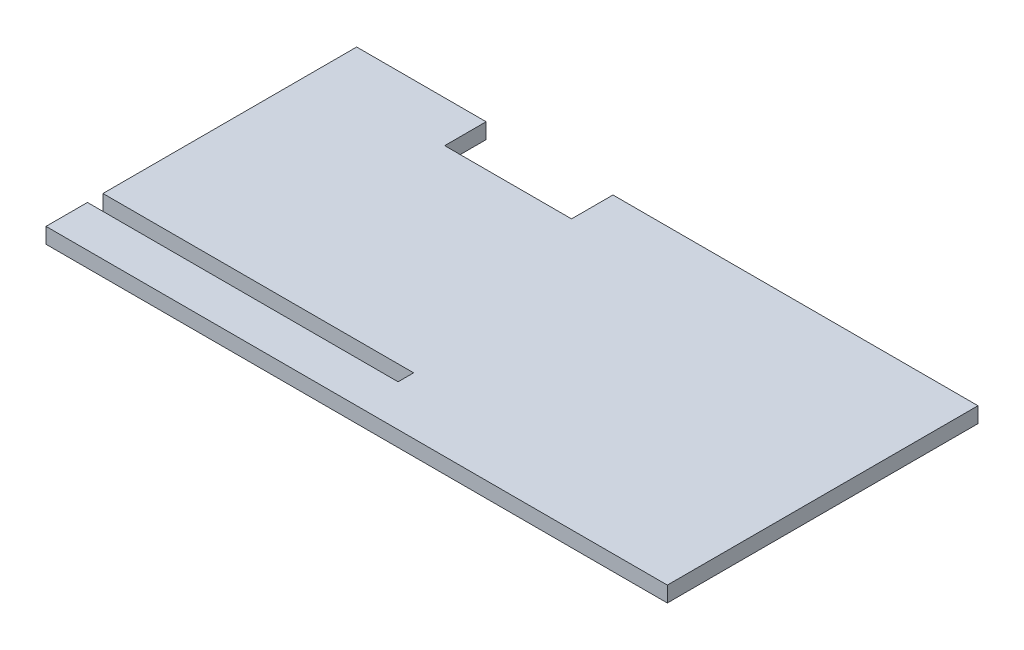
ISO-10303-21;
HEADER;
FILE_DESCRIPTION(('STEP AP214'),'2;1');
FILE_NAME('part.step','',(''),(''),'','','');
FILE_SCHEMA(('AUTOMOTIVE_DESIGN { 1 0 10303 214 1 1 1 1 }'));
ENDSEC;
DATA;
#1=APPLICATION_CONTEXT('core data for automotive mechanical design processes');
#2=APPLICATION_PROTOCOL_DEFINITION('international standard','automotive_design',2000,#1);
#3=PRODUCT_CONTEXT('',#1,'mechanical');
#4=PRODUCT('Part','Part','',(#3));
#5=PRODUCT_RELATED_PRODUCT_CATEGORY('part','',(#4));
#6=PRODUCT_DEFINITION_FORMATION('','',#4);
#7=PRODUCT_DEFINITION_CONTEXT('part definition',#1,'design');
#8=PRODUCT_DEFINITION('design','',#6,#7);
#9=PRODUCT_DEFINITION_SHAPE('','',#8);
#10=(LENGTH_UNIT() NAMED_UNIT(*) SI_UNIT(.MILLI.,.METRE.));
#11=(NAMED_UNIT(*) PLANE_ANGLE_UNIT() SI_UNIT($,.RADIAN.));
#12=(NAMED_UNIT(*) SI_UNIT($,.STERADIAN.) SOLID_ANGLE_UNIT());
#13=UNCERTAINTY_MEASURE_WITH_UNIT(LENGTH_MEASURE(1.E-05),#10,'distance_accuracy_value','');
#14=(GEOMETRIC_REPRESENTATION_CONTEXT(3) GLOBAL_UNCERTAINTY_ASSIGNED_CONTEXT((#13)) GLOBAL_UNIT_ASSIGNED_CONTEXT((#10,
#11,#12)) REPRESENTATION_CONTEXT('',''));
#15=CARTESIAN_POINT('',(0.,0.,0.));
#16=DIRECTION('',(0.,0.,1.));
#17=DIRECTION('',(1.,0.,0.));
#18=AXIS2_PLACEMENT_3D('',#15,#16,#17);
#19=CARTESIAN_POINT('',(-10.5,3.,0.));
#20=DIRECTION('',(-1.,0.,0.));
#21=DIRECTION('',(0.,0.,1.));
#22=AXIS2_PLACEMENT_3D('',#19,#20,#21);
#23=PLANE('',#22);
#24=DIRECTION('',(0.,0.,-1.));
#25=VECTOR('',#24,1.);
#26=CARTESIAN_POINT('',(-10.5,0.,0.));
#27=LINE('',#26,#25);
#28=CARTESIAN_POINT('',(-10.5,0.,-32.));
#29=VERTEX_POINT('',#28);
#30=CARTESIAN_POINT('',(-10.5,0.,-40.));
#31=VERTEX_POINT('',#30);
#32=EDGE_CURVE('E159',#29,#31,#27,.T.);
#33=ORIENTED_EDGE('',*,*,#32,.F.);
#34=DIRECTION('',(0.,-1.,0.));
#35=VECTOR('',#34,1.);
#36=CARTESIAN_POINT('',(-10.5,3.,-32.));
#37=LINE('',#36,#35);
#38=CARTESIAN_POINT('',(-10.5,3.,-32.));
#39=VERTEX_POINT('',#38);
#40=EDGE_CURVE('E12',#39,#29,#37,.T.);
#41=ORIENTED_EDGE('',*,*,#40,.F.);
#42=DIRECTION('',(0.,0.,-1.));
#43=VECTOR('',#42,1.);
#44=CARTESIAN_POINT('',(-10.5,3.,0.));
#45=LINE('',#44,#43);
#46=CARTESIAN_POINT('',(-10.5,3.,-40.));
#47=VERTEX_POINT('',#46);
#48=EDGE_CURVE('E249',#39,#47,#45,.T.);
#49=ORIENTED_EDGE('',*,*,#48,.T.);
#50=DIRECTION('',(0.,-1.,0.));
#51=VECTOR('',#50,1.);
#52=CARTESIAN_POINT('',(-10.5,3.,-40.));
#53=LINE('',#52,#51);
#54=EDGE_CURVE('E54',#47,#31,#53,.T.);
#55=ORIENTED_EDGE('',*,*,#54,.T.);
#56=EDGE_LOOP('',(#33,#41,#49,#55));
#57=FACE_BOUND('',#56,.T.);
#58=ADVANCED_FACE('F38',(#57),#23,.T.);
#59=CARTESIAN_POINT('',(0.,3.,-32.));
#60=DIRECTION('',(0.,0.,-1.));
#61=DIRECTION('',(-1.,0.,0.));
#62=AXIS2_PLACEMENT_3D('',#59,#60,#61);
#63=PLANE('',#62);
#64=DIRECTION('',(1.,0.,0.));
#65=VECTOR('',#64,1.);
#66=CARTESIAN_POINT('',(0.,0.,-32.));
#67=LINE('',#66,#65);
#68=CARTESIAN_POINT('',(-35.,0.,-32.));
#69=VERTEX_POINT('',#68);
#70=EDGE_CURVE('E226',#69,#29,#67,.T.);
#71=ORIENTED_EDGE('',*,*,#70,.F.);
#72=DIRECTION('',(0.,-1.,0.));
#73=VECTOR('',#72,1.);
#74=CARTESIAN_POINT('',(-35.,3.,-32.));
#75=LINE('',#74,#73);
#76=CARTESIAN_POINT('',(-35.,3.,-32.));
#77=VERTEX_POINT('',#76);
#78=EDGE_CURVE('E46',#77,#69,#75,.T.);
#79=ORIENTED_EDGE('',*,*,#78,.F.);
#80=DIRECTION('',(1.,0.,0.));
#81=VECTOR('',#80,1.);
#82=CARTESIAN_POINT('',(0.,3.,-32.));
#83=LINE('',#82,#81);
#84=EDGE_CURVE('E251',#77,#39,#83,.T.);
#85=ORIENTED_EDGE('',*,*,#84,.T.);
#86=ORIENTED_EDGE('',*,*,#40,.T.);
#87=EDGE_LOOP('',(#71,#79,#85,#86));
#88=FACE_BOUND('',#87,.T.);
#89=ADVANCED_FACE('F227',(#88),#63,.T.);
#90=CARTESIAN_POINT('',(-35.,3.,0.));
#91=DIRECTION('',(1.,0.,0.));
#92=DIRECTION('',(0.,0.,-1.));
#93=AXIS2_PLACEMENT_3D('',#90,#91,#92);
#94=PLANE('',#93);
#95=DIRECTION('',(0.,0.,1.));
#96=VECTOR('',#95,1.);
#97=CARTESIAN_POINT('',(-35.,0.,0.));
#98=LINE('',#97,#96);
#99=CARTESIAN_POINT('',(-35.,0.,-40.));
#100=VERTEX_POINT('',#99);
#101=EDGE_CURVE('E218',#100,#69,#98,.T.);
#102=ORIENTED_EDGE('',*,*,#101,.F.);
#103=DIRECTION('',(0.,-1.,0.));
#104=VECTOR('',#103,1.);
#105=CARTESIAN_POINT('',(-35.,3.,-40.));
#106=LINE('',#105,#104);
#107=CARTESIAN_POINT('',(-35.,3.,-40.));
#108=VERTEX_POINT('',#107);
#109=EDGE_CURVE('E211',#108,#100,#106,.T.);
#110=ORIENTED_EDGE('',*,*,#109,.F.);
#111=DIRECTION('',(0.,0.,1.));
#112=VECTOR('',#111,1.);
#113=CARTESIAN_POINT('',(-35.,3.,0.));
#114=LINE('',#113,#112);
#115=EDGE_CURVE('E221',#108,#77,#114,.T.);
#116=ORIENTED_EDGE('',*,*,#115,.T.);
#117=ORIENTED_EDGE('',*,*,#78,.T.);
#118=EDGE_LOOP('',(#102,#110,#116,#117));
#119=FACE_BOUND('',#118,.T.);
#120=ADVANCED_FACE('F216',(#119),#94,.T.);
#121=CARTESIAN_POINT('',(0.,3.,-40.));
#122=DIRECTION('',(0.,0.,-1.));
#123=DIRECTION('',(-1.,0.,0.));
#124=AXIS2_PLACEMENT_3D('',#121,#122,#123);
#125=PLANE('',#124);
#126=DIRECTION('',(1.,0.,0.));
#127=VECTOR('',#126,1.);
#128=CARTESIAN_POINT('',(0.,0.,-40.));
#129=LINE('',#128,#127);
#130=CARTESIAN_POINT('',(-60.,0.,-40.));
#131=VERTEX_POINT('',#130);
#132=EDGE_CURVE('E232',#131,#100,#129,.T.);
#133=ORIENTED_EDGE('',*,*,#132,.F.);
#134=DIRECTION('',(0.,-1.,0.));
#135=VECTOR('',#134,1.);
#136=CARTESIAN_POINT('',(-60.,3.,-40.));
#137=LINE('',#136,#135);
#138=CARTESIAN_POINT('',(-60.,3.,-40.));
#139=VERTEX_POINT('',#138);
#140=EDGE_CURVE('E209',#139,#131,#137,.T.);
#141=ORIENTED_EDGE('',*,*,#140,.F.);
#142=DIRECTION('',(1.,0.,0.));
#143=VECTOR('',#142,1.);
#144=CARTESIAN_POINT('',(0.,3.,-40.));
#145=LINE('',#144,#143);
#146=EDGE_CURVE('E154',#139,#108,#145,.T.);
#147=ORIENTED_EDGE('',*,*,#146,.T.);
#148=ORIENTED_EDGE('',*,*,#109,.T.);
#149=EDGE_LOOP('',(#133,#141,#147,#148));
#150=FACE_BOUND('',#149,.T.);
#151=ADVANCED_FACE('F265',(#150),#125,.T.);
#152=CARTESIAN_POINT('',(-60.,3.,0.));
#153=DIRECTION('',(-1.,0.,0.));
#154=DIRECTION('',(0.,0.,1.));
#155=AXIS2_PLACEMENT_3D('',#152,#153,#154);
#156=PLANE('',#155);
#157=DIRECTION('',(0.,0.,-1.));
#158=VECTOR('',#157,1.);
#159=CARTESIAN_POINT('',(-60.,0.,0.));
#160=LINE('',#159,#158);
#161=CARTESIAN_POINT('',(-60.,0.,9.));
#162=VERTEX_POINT('',#161);
#163=EDGE_CURVE('E234',#162,#131,#160,.T.);
#164=ORIENTED_EDGE('',*,*,#163,.F.);
#165=DIRECTION('',(0.,-1.,0.));
#166=VECTOR('',#165,1.);
#167=CARTESIAN_POINT('',(-60.,3.,9.));
#168=LINE('',#167,#166);
#169=CARTESIAN_POINT('',(-60.,3.,9.));
#170=VERTEX_POINT('',#169);
#171=EDGE_CURVE('E207',#170,#162,#168,.T.);
#172=ORIENTED_EDGE('',*,*,#171,.F.);
#173=DIRECTION('',(0.,0.,-1.));
#174=VECTOR('',#173,1.);
#175=CARTESIAN_POINT('',(-60.,3.,0.));
#176=LINE('',#175,#174);
#177=EDGE_CURVE('E166',#170,#139,#176,.T.);
#178=ORIENTED_EDGE('',*,*,#177,.T.);
#179=ORIENTED_EDGE('',*,*,#140,.T.);
#180=EDGE_LOOP('',(#164,#172,#178,#179));
#181=FACE_BOUND('',#180,.T.);
#182=ADVANCED_FACE('F269',(#181),#156,.T.);
#183=CARTESIAN_POINT('',(0.,3.,9.));
#184=DIRECTION('',(0.,0.,-1.));
#185=DIRECTION('',(-1.,0.,0.));
#186=AXIS2_PLACEMENT_3D('',#183,#184,#185);
#187=PLANE('',#186);
#188=DIRECTION('',(1.,0.,0.));
#189=VECTOR('',#188,1.);
#190=CARTESIAN_POINT('',(0.,0.,9.));
#191=LINE('',#190,#189);
#192=CARTESIAN_POINT('',(0.,0.,9.));
#193=VERTEX_POINT('',#192);
#194=EDGE_CURVE('E239',#162,#193,#191,.T.);
#195=ORIENTED_EDGE('',*,*,#194,.T.);
#196=DIRECTION('',(0.,-1.,0.));
#197=VECTOR('',#196,1.);
#198=CARTESIAN_POINT('',(0.,3.,9.));
#199=LINE('',#198,#197);
#200=CARTESIAN_POINT('',(0.,3.,9.));
#201=VERTEX_POINT('',#200);
#202=EDGE_CURVE('E204',#201,#193,#199,.T.);
#203=ORIENTED_EDGE('',*,*,#202,.F.);
#204=DIRECTION('',(1.,0.,0.));
#205=VECTOR('',#204,1.);
#206=CARTESIAN_POINT('',(0.,3.,9.));
#207=LINE('',#206,#205);
#208=EDGE_CURVE('E171',#170,#201,#207,.T.);
#209=ORIENTED_EDGE('',*,*,#208,.F.);
#210=ORIENTED_EDGE('',*,*,#171,.T.);
#211=EDGE_LOOP('',(#195,#203,#209,#210));
#212=FACE_BOUND('',#211,.T.);
#213=ADVANCED_FACE('F274',(#212),#187,.F.);
#214=CARTESIAN_POINT('',(0.,3.,0.));
#215=DIRECTION('',(1.,0.,0.));
#216=DIRECTION('',(0.,0.,-1.));
#217=AXIS2_PLACEMENT_3D('',#214,#215,#216);
#218=PLANE('',#217);
#219=DIRECTION('',(0.,0.,1.));
#220=VECTOR('',#219,1.);
#221=CARTESIAN_POINT('',(0.,0.,0.));
#222=LINE('',#221,#220);
#223=CARTESIAN_POINT('',(0.,0.,12.));
#224=VERTEX_POINT('',#223);
#225=EDGE_CURVE('E241',#193,#224,#222,.T.);
#226=ORIENTED_EDGE('',*,*,#225,.T.);
#227=DIRECTION('',(0.,-1.,0.));
#228=VECTOR('',#227,1.);
#229=CARTESIAN_POINT('',(0.,3.,12.));
#230=LINE('',#229,#228);
#231=CARTESIAN_POINT('',(0.,3.,12.));
#232=VERTEX_POINT('',#231);
#233=EDGE_CURVE('E198',#232,#224,#230,.T.);
#234=ORIENTED_EDGE('',*,*,#233,.F.);
#235=DIRECTION('',(0.,0.,1.));
#236=VECTOR('',#235,1.);
#237=CARTESIAN_POINT('',(0.,3.,0.));
#238=LINE('',#237,#236);
#239=EDGE_CURVE('E181',#201,#232,#238,.T.);
#240=ORIENTED_EDGE('',*,*,#239,.F.);
#241=ORIENTED_EDGE('',*,*,#202,.T.);
#242=EDGE_LOOP('',(#226,#234,#240,#241));
#243=FACE_BOUND('',#242,.T.);
#244=ADVANCED_FACE('F279',(#243),#218,.F.);
#245=CARTESIAN_POINT('',(0.,3.,12.));
#246=DIRECTION('',(0.,0.,1.));
#247=DIRECTION('',(1.,0.,0.));
#248=AXIS2_PLACEMENT_3D('',#245,#246,#247);
#249=PLANE('',#248);
#250=DIRECTION('',(-1.,0.,0.));
#251=VECTOR('',#250,1.);
#252=CARTESIAN_POINT('',(0.,0.,12.));
#253=LINE('',#252,#251);
#254=CARTESIAN_POINT('',(-60.,0.,12.));
#255=VERTEX_POINT('',#254);
#256=EDGE_CURVE('E243',#224,#255,#253,.T.);
#257=ORIENTED_EDGE('',*,*,#256,.T.);
#258=DIRECTION('',(0.,-1.,0.));
#259=VECTOR('',#258,1.);
#260=CARTESIAN_POINT('',(-60.,3.,12.));
#261=LINE('',#260,#259);
#262=CARTESIAN_POINT('',(-60.,3.,12.));
#263=VERTEX_POINT('',#262);
#264=EDGE_CURVE('E193',#263,#255,#261,.T.);
#265=ORIENTED_EDGE('',*,*,#264,.F.);
#266=DIRECTION('',(-1.,0.,0.));
#267=VECTOR('',#266,1.);
#268=CARTESIAN_POINT('',(0.,3.,12.));
#269=LINE('',#268,#267);
#270=EDGE_CURVE('E184',#232,#263,#269,.T.);
#271=ORIENTED_EDGE('',*,*,#270,.F.);
#272=ORIENTED_EDGE('',*,*,#233,.T.);
#273=EDGE_LOOP('',(#257,#265,#271,#272));
#274=FACE_BOUND('',#273,.T.);
#275=ADVANCED_FACE('F283',(#274),#249,.F.);
#276=CARTESIAN_POINT('',(-60.,0.,20.));
#277=VERTEX_POINT('',#276);
#278=EDGE_CURVE('E196',#277,#255,#160,.T.);
#279=ORIENTED_EDGE('',*,*,#278,.F.);
#280=DIRECTION('',(0.,-1.,0.));
#281=VECTOR('',#280,1.);
#282=CARTESIAN_POINT('',(-60.,3.,20.));
#283=LINE('',#282,#281);
#284=CARTESIAN_POINT('',(-60.,3.,20.));
#285=VERTEX_POINT('',#284);
#286=EDGE_CURVE('E147',#285,#277,#283,.T.);
#287=ORIENTED_EDGE('',*,*,#286,.F.);
#288=EDGE_CURVE('E136',#285,#263,#176,.T.);
#289=ORIENTED_EDGE('',*,*,#288,.T.);
#290=ORIENTED_EDGE('',*,*,#264,.T.);
#291=EDGE_LOOP('',(#279,#287,#289,#290));
#292=FACE_BOUND('',#291,.T.);
#293=ADVANCED_FACE('F192',(#292),#156,.T.);
#294=CARTESIAN_POINT('',(0.,3.,20.));
#295=DIRECTION('',(0.,0.,-1.));
#296=DIRECTION('',(-1.,0.,0.));
#297=AXIS2_PLACEMENT_3D('',#294,#295,#296);
#298=PLANE('',#297);
#299=DIRECTION('',(1.,0.,0.));
#300=VECTOR('',#299,1.);
#301=CARTESIAN_POINT('',(0.,0.,20.));
#302=LINE('',#301,#300);
#303=CARTESIAN_POINT('',(60.,0.,20.));
#304=VERTEX_POINT('',#303);
#305=EDGE_CURVE('E144',#277,#304,#302,.T.);
#306=ORIENTED_EDGE('',*,*,#305,.T.);
#307=DIRECTION('',(0.,-1.,0.));
#308=VECTOR('',#307,1.);
#309=CARTESIAN_POINT('',(60.,3.,20.));
#310=LINE('',#309,#308);
#311=CARTESIAN_POINT('',(60.,3.,20.));
#312=VERTEX_POINT('',#311);
#313=EDGE_CURVE('E141',#312,#304,#310,.T.);
#314=ORIENTED_EDGE('',*,*,#313,.F.);
#315=DIRECTION('',(1.,0.,0.));
#316=VECTOR('',#315,1.);
#317=CARTESIAN_POINT('',(0.,3.,20.));
#318=LINE('',#317,#316);
#319=EDGE_CURVE('E129',#285,#312,#318,.T.);
#320=ORIENTED_EDGE('',*,*,#319,.F.);
#321=ORIENTED_EDGE('',*,*,#286,.T.);
#322=EDGE_LOOP('',(#306,#314,#320,#321));
#323=FACE_BOUND('',#322,.T.);
#324=ADVANCED_FACE('F142',(#323),#298,.F.);
#325=CARTESIAN_POINT('',(60.,3.,0.));
#326=DIRECTION('',(-1.,0.,0.));
#327=DIRECTION('',(0.,0.,1.));
#328=AXIS2_PLACEMENT_3D('',#325,#326,#327);
#329=PLANE('',#328);
#330=DIRECTION('',(0.,0.,-1.));
#331=VECTOR('',#330,1.);
#332=CARTESIAN_POINT('',(60.,0.,0.));
#333=LINE('',#332,#331);
#334=CARTESIAN_POINT('',(60.,0.,-40.));
#335=VERTEX_POINT('',#334);
#336=EDGE_CURVE('E246',#304,#335,#333,.T.);
#337=ORIENTED_EDGE('',*,*,#336,.T.);
#338=DIRECTION('',(0.,-1.,0.));
#339=VECTOR('',#338,1.);
#340=CARTESIAN_POINT('',(60.,3.,-40.));
#341=LINE('',#340,#339);
#342=CARTESIAN_POINT('',(60.,3.,-40.));
#343=VERTEX_POINT('',#342);
#344=EDGE_CURVE('E92',#343,#335,#341,.T.);
#345=ORIENTED_EDGE('',*,*,#344,.F.);
#346=DIRECTION('',(0.,0.,-1.));
#347=VECTOR('',#346,1.);
#348=CARTESIAN_POINT('',(60.,3.,0.));
#349=LINE('',#348,#347);
#350=EDGE_CURVE('E134',#312,#343,#349,.T.);
#351=ORIENTED_EDGE('',*,*,#350,.F.);
#352=ORIENTED_EDGE('',*,*,#313,.T.);
#353=EDGE_LOOP('',(#337,#345,#351,#352));
#354=FACE_BOUND('',#353,.T.);
#355=ADVANCED_FACE('F149',(#354),#329,.F.);
#356=EDGE_CURVE('E236',#31,#335,#129,.T.);
#357=ORIENTED_EDGE('',*,*,#356,.F.);
#358=ORIENTED_EDGE('',*,*,#54,.F.);
#359=EDGE_CURVE('E151',#47,#343,#145,.T.);
#360=ORIENTED_EDGE('',*,*,#359,.T.);
#361=ORIENTED_EDGE('',*,*,#344,.T.);
#362=EDGE_LOOP('',(#357,#358,#360,#361));
#363=FACE_BOUND('',#362,.T.);
#364=ADVANCED_FACE('F296',(#363),#125,.T.);
#365=CARTESIAN_POINT('',(0.,3.,0.));
#366=DIRECTION('',(0.,1.,0.));
#367=DIRECTION('',(0.,0.,1.));
#368=AXIS2_PLACEMENT_3D('',#365,#366,#367);
#369=PLANE('',#368);
#370=ORIENTED_EDGE('',*,*,#48,.F.);
#371=ORIENTED_EDGE('',*,*,#84,.F.);
#372=ORIENTED_EDGE('',*,*,#115,.F.);
#373=ORIENTED_EDGE('',*,*,#146,.F.);
#374=ORIENTED_EDGE('',*,*,#177,.F.);
#375=ORIENTED_EDGE('',*,*,#208,.T.);
#376=ORIENTED_EDGE('',*,*,#239,.T.);
#377=ORIENTED_EDGE('',*,*,#270,.T.);
#378=ORIENTED_EDGE('',*,*,#288,.F.);
#379=ORIENTED_EDGE('',*,*,#319,.T.);
#380=ORIENTED_EDGE('',*,*,#350,.T.);
#381=ORIENTED_EDGE('',*,*,#359,.F.);
#382=EDGE_LOOP('',(#370,#371,#372,#373,#374,#375,#376,#377,#378,#379,#380,#381));
#383=FACE_BOUND('',#382,.T.);
#384=ADVANCED_FACE('F131',(#383),#369,.T.);
#385=CARTESIAN_POINT('',(0.,0.,0.));
#386=DIRECTION('',(0.,1.,0.));
#387=DIRECTION('',(0.,0.,1.));
#388=AXIS2_PLACEMENT_3D('',#385,#386,#387);
#389=PLANE('',#388);
#390=ORIENTED_EDGE('',*,*,#32,.T.);
#391=ORIENTED_EDGE('',*,*,#356,.T.);
#392=ORIENTED_EDGE('',*,*,#336,.F.);
#393=ORIENTED_EDGE('',*,*,#305,.F.);
#394=ORIENTED_EDGE('',*,*,#278,.T.);
#395=ORIENTED_EDGE('',*,*,#256,.F.);
#396=ORIENTED_EDGE('',*,*,#225,.F.);
#397=ORIENTED_EDGE('',*,*,#194,.F.);
#398=ORIENTED_EDGE('',*,*,#163,.T.);
#399=ORIENTED_EDGE('',*,*,#132,.T.);
#400=ORIENTED_EDGE('',*,*,#101,.T.);
#401=ORIENTED_EDGE('',*,*,#70,.T.);
#402=EDGE_LOOP('',(#390,#391,#392,#393,#394,#395,#396,#397,#398,#399,#400,#401));
#403=FACE_BOUND('',#402,.T.);
#404=ADVANCED_FACE('F229',(#403),#389,.F.);
#405=CLOSED_SHELL('',(#58,#89,#120,#151,#182,#213,#244,#275,#293,#324,#355,#364,#384,#404));
#406=MANIFOLD_SOLID_BREP('B2',#405);
#407=ADVANCED_BREP_SHAPE_REPRESENTATION('',(#18,#406),#14);
#408=SHAPE_DEFINITION_REPRESENTATION(#9,#407);
ENDSEC;
END-ISO-10303-21;
